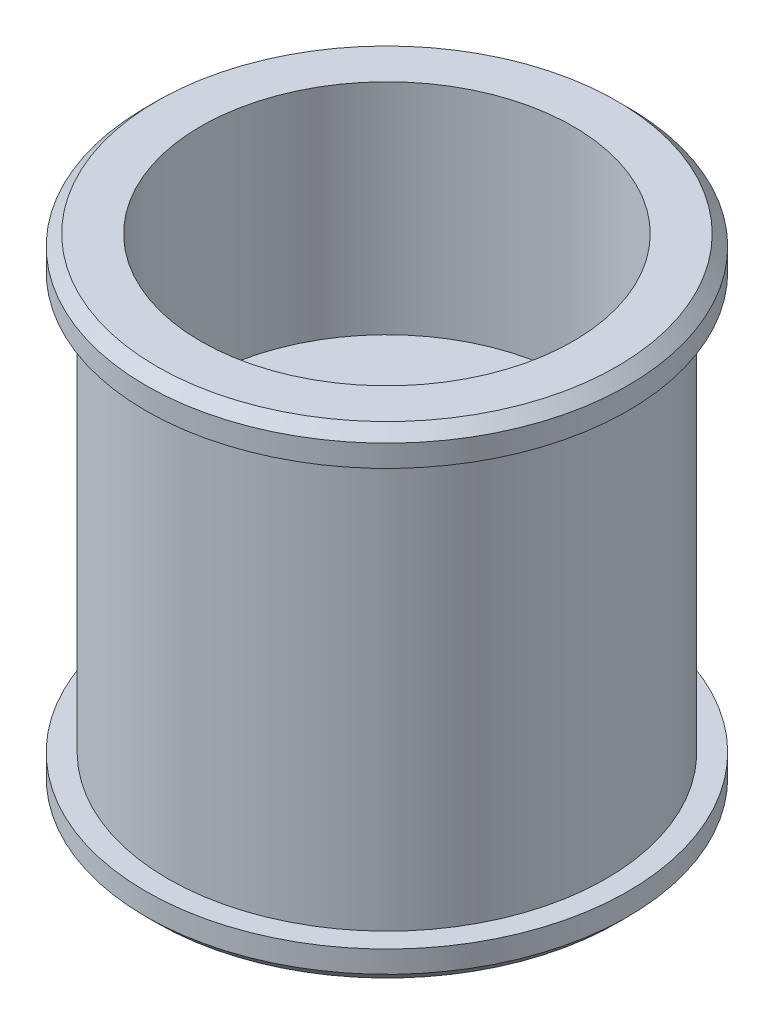
ISO-10303-21;
HEADER;
FILE_DESCRIPTION(('STEP AP214'),'2;1');
FILE_NAME('part.step','',(''),(''),'','','');
FILE_SCHEMA(('AUTOMOTIVE_DESIGN { 1 0 10303 214 1 1 1 1 }'));
ENDSEC;
DATA;
#1=APPLICATION_CONTEXT('core data for automotive mechanical design processes');
#2=APPLICATION_PROTOCOL_DEFINITION('international standard','automotive_design',2000,#1);
#3=PRODUCT_CONTEXT('',#1,'mechanical');
#4=PRODUCT('Part','Part','',(#3));
#5=PRODUCT_RELATED_PRODUCT_CATEGORY('part','',(#4));
#6=PRODUCT_DEFINITION_FORMATION('','',#4);
#7=PRODUCT_DEFINITION_CONTEXT('part definition',#1,'design');
#8=PRODUCT_DEFINITION('design','',#6,#7);
#9=PRODUCT_DEFINITION_SHAPE('','',#8);
#10=(LENGTH_UNIT() NAMED_UNIT(*) SI_UNIT(.MILLI.,.METRE.));
#11=(NAMED_UNIT(*) PLANE_ANGLE_UNIT() SI_UNIT($,.RADIAN.));
#12=(NAMED_UNIT(*) SI_UNIT($,.STERADIAN.) SOLID_ANGLE_UNIT());
#13=UNCERTAINTY_MEASURE_WITH_UNIT(LENGTH_MEASURE(1.E-05),#10,'distance_accuracy_value','');
#14=(GEOMETRIC_REPRESENTATION_CONTEXT(3) GLOBAL_UNCERTAINTY_ASSIGNED_CONTEXT((#13)) GLOBAL_UNIT_ASSIGNED_CONTEXT((#10,
#11,#12)) REPRESENTATION_CONTEXT('',''));
#15=CARTESIAN_POINT('',(0.,0.,0.));
#16=DIRECTION('',(0.,0.,1.));
#17=DIRECTION('',(1.,0.,0.));
#18=AXIS2_PLACEMENT_3D('',#15,#16,#17);
#19=CARTESIAN_POINT('',(0.,22.,0.));
#20=DIRECTION('',(0.,-1.,0.));
#21=DIRECTION('',(0.,0.,-1.));
#22=AXIS2_PLACEMENT_3D('',#19,#20,#21);
#23=CYLINDRICAL_SURFACE('',#22,1.5);
#24=CARTESIAN_POINT('',(0.,0.,0.));
#25=DIRECTION('',(0.,1.,0.));
#26=DIRECTION('',(0.,0.,1.));
#27=AXIS2_PLACEMENT_3D('',#24,#25,#26);
#28=CIRCLE('',#27,1.5);
#29=CARTESIAN_POINT('',(0.,0.,1.5));
#30=VERTEX_POINT('',#29);
#31=EDGE_CURVE('E56',#30,#30,#28,.T.);
#32=ORIENTED_EDGE('',*,*,#31,.F.);
#33=EDGE_LOOP('',(#32));
#34=FACE_BOUND('',#33,.T.);
#35=CARTESIAN_POINT('',(-1.1180339887499,4.52987032528327,-1.));
#36=CARTESIAN_POINT('',(-1.11803876731408,4.57868448071758,-0.999997269988655));
#37=CARTESIAN_POINT('',(-1.12129035523721,4.62751570213767,-0.99639496251832));
#38=CARTESIAN_POINT('',(-1.13365986250808,4.72343028110868,-0.982291341588655));
#39=CARTESIAN_POINT('',(-1.14278830406355,4.77051034304805,-0.971777652939311));
#40=CARTESIAN_POINT('',(-1.16528292912785,4.86123804622211,-0.94467930838316));
#41=CARTESIAN_POINT('',(-1.17860780897301,4.9049141736521,-0.92815359007107));
#42=CARTESIAN_POINT('',(-1.20792047340913,4.9888032414566,-0.889670041967692));
#43=CARTESIAN_POINT('',(-1.22390881079415,5.02901546027151,-0.867711084060814));
#44=CARTESIAN_POINT('',(-1.25973036466013,5.11169376909173,-0.815012050038569));
#45=CARTESIAN_POINT('',(-1.27977468045182,5.15353638414187,-0.783437177258661));
#46=CARTESIAN_POINT('',(-1.31972413654041,5.23187167972041,-0.714096098703399));
#47=CARTESIAN_POINT('',(-1.33962912148992,5.26835908611254,-0.6763238658854));
#48=CARTESIAN_POINT('',(-1.38044409261874,5.3401921546741,-0.589078452471477));
#49=CARTESIAN_POINT('',(-1.40108392923461,5.37461158117111,-0.538703219829095));
#50=CARTESIAN_POINT('',(-1.43779242241382,5.43419137302831,-0.431235482106116));
#51=CARTESIAN_POINT('',(-1.45386618115518,5.45936208229887,-0.374150576160852));
#52=CARTESIAN_POINT('',(-1.47799953732363,5.496648525792,-0.261624536740002));
#53=CARTESIAN_POINT('',(-1.48675587807934,5.50991199753105,-0.206717362590709));
#54=CARTESIAN_POINT('',(-1.49804872730961,5.52696256992509,-0.0948477243649315));
#55=CARTESIAN_POINT('',(-1.5005930688118,5.53076160489599,-0.037887940642913));
#56=CARTESIAN_POINT('',(-1.49927680861477,5.52878410030875,0.0670735251161643));
#57=CARTESIAN_POINT('',(-1.49633132455064,5.52437579962474,0.115120319004376));
#58=CARTESIAN_POINT('',(-1.4860409139501,5.50882479960382,0.209619316635507));
#59=CARTESIAN_POINT('',(-1.47869566656551,5.4976816091315,0.256071403824861));
#60=CARTESIAN_POINT('',(-1.46026045851868,5.46927248288598,0.346038968835584));
#61=CARTESIAN_POINT('',(-1.44918538991339,5.45203088268399,0.38956531192298));
#62=CARTESIAN_POINT('',(-1.42410552238144,5.41209350380686,0.473104575326777));
#63=CARTESIAN_POINT('',(-1.41010018872581,5.38939672953252,0.513116852484701));
#64=CARTESIAN_POINT('',(-1.37809029225351,5.33588095655333,0.594142145981719));
#65=CARTESIAN_POINT('',(-1.35980204396013,5.30438656360688,0.634595740498538));
#66=CARTESIAN_POINT('',(-1.32200300913499,5.23592098554311,0.709994037491522));
#67=CARTESIAN_POINT('',(-1.30249036407616,5.19894135231637,0.744930067597284));
#68=CARTESIAN_POINT('',(-1.26075022472076,5.11388872017663,0.813861176630826));
#69=CARTESIAN_POINT('',(-1.23857160004468,5.06498478542603,0.846867965631776));
#70=CARTESIAN_POINT('',(-1.19737805415546,4.96111540567291,0.904174374727407));
#71=CARTESIAN_POINT('',(-1.17835785767438,4.9061603280763,0.92848859327447));
#72=CARTESIAN_POINT('',(-1.15131435153449,4.80751079424673,0.961663622838891));
#73=CARTESIAN_POINT('',(-1.1417018228885,4.76507364025488,0.972953958737704));
#74=CARTESIAN_POINT('',(-1.1270451989479,4.67835058037481,0.989897777900029));
#75=CARTESIAN_POINT('',(-1.12199318391119,4.63406801969681,0.995561034821825));
#76=CARTESIAN_POINT('',(-1.11723778493745,4.54464883206268,1.00089700074453));
#77=CARTESIAN_POINT('',(-1.11755766933454,4.49950933602379,1.00054364876605));
#78=CARTESIAN_POINT('',(-1.12354940184257,4.41002840830517,0.993808148581262));
#79=CARTESIAN_POINT('',(-1.12922558823607,4.36568765322741,0.987421113449806));
#80=CARTESIAN_POINT('',(-1.14463988751152,4.28117561651041,0.969499055937226));
#81=CARTESIAN_POINT('',(-1.15416593537715,4.24090647078949,0.958230872657146));
#82=CARTESIAN_POINT('',(-1.17614979263984,4.16280720725061,0.931115208135282));
#83=CARTESIAN_POINT('',(-1.18860858636727,4.12497791377377,0.915266188999618));
#84=CARTESIAN_POINT('',(-1.21805741810736,4.0447693233949,0.875816733031263));
#85=CARTESIAN_POINT('',(-1.23545540768822,4.00299191965232,0.851300144226031));
#86=CARTESIAN_POINT('',(-1.27131257456476,3.9236619241183,0.79676365764559));
#87=CARTESIAN_POINT('',(-1.2897730248931,3.88611456695385,0.766737059459379));
#88=CARTESIAN_POINT('',(-1.33037839141598,3.80788915149803,0.694383288512648));
#89=CARTESIAN_POINT('',(-1.35244726064259,3.76831890114542,0.650801932557862));
#90=CARTESIAN_POINT('',(-1.39387790925842,3.6969619838268,0.556549744344255));
#91=CARTESIAN_POINT('',(-1.41324207395941,3.66516843965821,0.505885238731677));
#92=CARTESIAN_POINT('',(-1.44395410620131,3.61592445582181,0.408743737408333));
#93=CARTESIAN_POINT('',(-1.45612729055242,3.59689207306237,0.363331182442473));
#94=CARTESIAN_POINT('',(-1.47639353933783,3.56556672812376,0.269378539510945));
#95=CARTESIAN_POINT('',(-1.48449004936067,3.55326807385358,0.220841131929569));
#96=CARTESIAN_POINT('',(-1.49589182013302,3.5360218433637,0.121684696151537));
#97=CARTESIAN_POINT('',(-1.49917575428247,3.53110698552988,0.0710574184621101));
#98=CARTESIAN_POINT('',(-1.50054910514547,3.52904639957477,-0.0304277732903161));
#99=CARTESIAN_POINT('',(-1.49863900469456,3.5318999493052,-0.0812856654767108));
#100=CARTESIAN_POINT('',(-1.49014777988657,3.54470006978561,-0.177878766264065));
#101=CARTESIAN_POINT('',(-1.48391638604927,3.55411581771417,-0.223717571535269));
#102=CARTESIAN_POINT('',(-1.46768053103468,3.57898932999872,-0.313009211498528));
#103=CARTESIAN_POINT('',(-1.45767548373552,3.5944480329569,-0.356461674343444));
#104=CARTESIAN_POINT('',(-1.43395882743097,3.63183967772528,-0.442573648304176));
#105=CARTESIAN_POINT('',(-1.42006624473169,3.65409547903081,-0.485041794600133));
#106=CARTESIAN_POINT('',(-1.38987704117736,3.70394564759626,-0.565776331341591));
#107=CARTESIAN_POINT('',(-1.37357898322632,3.73154320925927,-0.604040186025009));
#108=CARTESIAN_POINT('',(-1.33696465736197,3.79618477645143,-0.68164711100701));
#109=CARTESIAN_POINT('',(-1.31641956938685,3.83403183712029,-0.720213397630456));
#110=CARTESIAN_POINT('',(-1.27526678824743,3.91542709605619,-0.790800111407978));
#111=CARTESIAN_POINT('',(-1.25465905985077,3.95897951970032,-0.822815641619616));
#112=CARTESIAN_POINT('',(-1.21692106795149,4.04780412066092,-0.877566267592056));
#113=CARTESIAN_POINT('',(-1.19964543370952,4.09269123025844,-0.90082323448605));
#114=CARTESIAN_POINT('',(-1.16873750795511,4.18651254977985,-0.940579011701362));
#115=CARTESIAN_POINT('',(-1.15509815647652,4.23543867221435,-0.957090951406666));
#116=CARTESIAN_POINT('',(-1.1359552596477,4.32525605949554,-0.979681312354539));
#117=CARTESIAN_POINT('',(-1.12931847705076,4.36552444367842,-0.987261141866241));
#118=CARTESIAN_POINT('',(-1.12035759608004,4.44714852553554,-0.997419579094631));
#119=CARTESIAN_POINT('',(-1.11802993920738,4.48850329741356,-1.00000231351858));
#120=CARTESIAN_POINT('',(-1.1180339887499,4.52987032528327,-1.));
#121=B_SPLINE_CURVE_WITH_KNOTS('',3,(#35,#36,#37,#38,#39,#40,#41,#42,#43,#44,#45,#46,#47,#48,
#49,#50,#51,#52,#53,#54,#55,#56,#57,#58,#59,#60,#61,#62,#63,#64,#65,#66,#67,#68,#69,#70,#71,#72,
#73,#74,#75,#76,#77,#78,#79,#80,#81,#82,#83,#84,#85,#86,#87,#88,#89,#90,#91,#92,#93,#94,#95,#96,
#97,#98,#99,#100,#101,#102,#103,#104,#105,#106,#107,#108,#109,#110,#111,#112,#113,#114,#115,
#116,#117,#118,#119,#120),.UNSPECIFIED.,.T.,.F.,(4,2,2,2,2,2,2,2,2,2,2,2,2,2,2,2,2,2,2,2,2,2,2,
2,2,2,2,2,2,2,2,2,2,2,2,2,2,2,2,2,2,2,4),(0.,0.146253465361077,0.292769521129644,
0.437886325608136,0.583033286332745,0.750773385343188,0.918677592181378,1.11083515503145,
1.3027771469429,1.4731874103179,1.64338268344149,1.78769767477871,1.93202319141873,
2.07577915986595,2.219561384515,2.38223762973317,2.54516707398319,2.73339351752472,
2.92130234871974,3.05563045200662,3.18972483117743,3.32440018819018,3.45918471785299,
3.58738225853468,3.71562288822479,3.86949615025543,4.0235577839993,4.21127342259657,
4.39882245285466,4.55035290305024,4.70175506443411,4.85382614632258,5.00588309222248,
5.1468839112404,5.28790663945594,5.43708931492125,5.58636147964719,5.75911103141433,
5.93198925208477,6.09167062897535,6.25103968323788,6.37508308151303,6.49902399831892),.UNSPECIFIED.);
#122=CARTESIAN_POINT('',(-1.1180339887499,4.52987032528327,-1.));
#123=VERTEX_POINT('',#122);
#124=EDGE_CURVE('E65',#123,#123,#121,.T.);
#125=ORIENTED_EDGE('',*,*,#124,.F.);
#126=EDGE_LOOP('',(#125));
#127=FACE_BOUND('',#126,.T.);
#128=CARTESIAN_POINT('',(0.,12.,0.));
#129=DIRECTION('',(0.,1.,0.));
#130=DIRECTION('',(0.,0.,1.));
#131=AXIS2_PLACEMENT_3D('',#128,#129,#130);
#132=CIRCLE('',#131,1.5);
#133=CARTESIAN_POINT('',(0.,12.,1.5));
#134=VERTEX_POINT('',#133);
#135=EDGE_CURVE('E40',#134,#134,#132,.T.);
#136=ORIENTED_EDGE('',*,*,#135,.T.);
#137=EDGE_LOOP('',(#136));
#138=FACE_BOUND('',#137,.T.);
#139=ADVANCED_FACE('F35',(#34,#127,#138),#23,.F.);
#140=CARTESIAN_POINT('',(0.,22.,0.));
#141=DIRECTION('',(0.,-1.,0.));
#142=DIRECTION('',(0.,0.,-1.));
#143=AXIS2_PLACEMENT_3D('',#140,#141,#142);
#144=CYLINDRICAL_SURFACE('',#143,11.);
#145=CARTESIAN_POINT('',(0.,0.500000000000004,0.));
#146=DIRECTION('',(0.,1.,0.));
#147=DIRECTION('',(0.,0.,1.));
#148=AXIS2_PLACEMENT_3D('',#145,#146,#147);
#149=CIRCLE('',#148,11.);
#150=CARTESIAN_POINT('',(0.,0.500000000000004,11.));
#151=VERTEX_POINT('',#150);
#152=EDGE_CURVE('E53',#151,#151,#149,.T.);
#153=ORIENTED_EDGE('',*,*,#152,.T.);
#154=EDGE_LOOP('',(#153));
#155=FACE_BOUND('',#154,.T.);
#156=CARTESIAN_POINT('',(0.,1.5,0.));
#157=DIRECTION('',(0.,1.,0.));
#158=DIRECTION('',(0.,0.,1.));
#159=AXIS2_PLACEMENT_3D('',#156,#157,#158);
#160=CIRCLE('',#159,11.);
#161=CARTESIAN_POINT('',(0.,1.5,11.));
#162=VERTEX_POINT('',#161);
#163=EDGE_CURVE('E66',#162,#162,#160,.T.);
#164=ORIENTED_EDGE('',*,*,#163,.F.);
#165=EDGE_LOOP('',(#164));
#166=FACE_BOUND('',#165,.T.);
#167=ADVANCED_FACE('F97',(#155,#166),#144,.T.);
#168=CARTESIAN_POINT('',(0.,22.,0.));
#169=DIRECTION('',(0.,1.,0.));
#170=DIRECTION('',(0.,0.,1.));
#171=AXIS2_PLACEMENT_3D('',#168,#169,#170);
#172=PLANE('',#171);
#173=CARTESIAN_POINT('',(0.,22.,0.));
#174=DIRECTION('',(0.,1.,0.));
#175=DIRECTION('',(0.,0.,1.));
#176=AXIS2_PLACEMENT_3D('',#173,#174,#175);
#177=CIRCLE('',#176,8.5);
#178=CARTESIAN_POINT('',(0.,22.,8.5));
#179=VERTEX_POINT('',#178);
#180=EDGE_CURVE('E89',#179,#179,#177,.T.);
#181=ORIENTED_EDGE('',*,*,#180,.F.);
#182=EDGE_LOOP('',(#181));
#183=FACE_BOUND('',#182,.T.);
#184=CARTESIAN_POINT('',(0.,22.,0.));
#185=DIRECTION('',(0.,1.,0.));
#186=DIRECTION('',(0.,0.,1.));
#187=AXIS2_PLACEMENT_3D('',#184,#185,#186);
#188=CIRCLE('',#187,10.5);
#189=CARTESIAN_POINT('',(0.,22.,10.5));
#190=VERTEX_POINT('',#189);
#191=EDGE_CURVE('E44',#190,#190,#188,.T.);
#192=ORIENTED_EDGE('',*,*,#191,.T.);
#193=EDGE_LOOP('',(#192));
#194=FACE_BOUND('',#193,.T.);
#195=ADVANCED_FACE('F100',(#183,#194),#172,.T.);
#196=CARTESIAN_POINT('',(0.,0.,0.));
#197=DIRECTION('',(0.,1.,0.));
#198=DIRECTION('',(0.,0.,1.));
#199=AXIS2_PLACEMENT_3D('',#196,#197,#198);
#200=PLANE('',#199);
#201=CARTESIAN_POINT('',(0.,0.,0.));
#202=DIRECTION('',(0.,1.,0.));
#203=DIRECTION('',(0.,0.,1.));
#204=AXIS2_PLACEMENT_3D('',#201,#202,#203);
#205=CIRCLE('',#204,10.5);
#206=CARTESIAN_POINT('',(0.,0.,10.5));
#207=VERTEX_POINT('',#206);
#208=EDGE_CURVE('E48',#207,#207,#205,.F.);
#209=ORIENTED_EDGE('',*,*,#208,.T.);
#210=EDGE_LOOP('',(#209));
#211=FACE_BOUND('',#210,.T.);
#212=ORIENTED_EDGE('',*,*,#31,.T.);
#213=EDGE_LOOP('',(#212));
#214=FACE_BOUND('',#213,.T.);
#215=ADVANCED_FACE('F103',(#211,#214),#200,.F.);
#216=CARTESIAN_POINT('',(0.,21.5,0.));
#217=DIRECTION('',(0.,1.,0.));
#218=DIRECTION('',(0.,0.,1.));
#219=AXIS2_PLACEMENT_3D('',#216,#217,#218);
#220=CIRCLE('',#219,11.);
#221=CARTESIAN_POINT('',(0.,21.5,11.));
#222=VERTEX_POINT('',#221);
#223=EDGE_CURVE('E10',#222,#222,#220,.F.);
#224=ORIENTED_EDGE('',*,*,#223,.T.);
#225=EDGE_LOOP('',(#224));
#226=FACE_BOUND('',#225,.T.);
#227=CARTESIAN_POINT('',(0.,20.5,0.));
#228=DIRECTION('',(0.,1.,0.));
#229=DIRECTION('',(0.,0.,1.));
#230=AXIS2_PLACEMENT_3D('',#227,#228,#229);
#231=CIRCLE('',#230,11.);
#232=CARTESIAN_POINT('',(0.,20.5,11.));
#233=VERTEX_POINT('',#232);
#234=EDGE_CURVE('E129',#233,#233,#231,.T.);
#235=ORIENTED_EDGE('',*,*,#234,.T.);
#236=EDGE_LOOP('',(#235));
#237=FACE_BOUND('',#236,.T.);
#238=ADVANCED_FACE('F107',(#226,#237),#144,.T.);
#239=CARTESIAN_POINT('',(0.,1.5,0.));
#240=DIRECTION('',(0.,1.,0.));
#241=DIRECTION('',(0.,0.,1.));
#242=AXIS2_PLACEMENT_3D('',#239,#240,#241);
#243=PLANE('',#242);
#244=CARTESIAN_POINT('',(0.,1.5,0.));
#245=DIRECTION('',(0.,1.,0.));
#246=DIRECTION('',(0.,0.,1.));
#247=AXIS2_PLACEMENT_3D('',#244,#245,#246);
#248=CIRCLE('',#247,10.);
#249=CARTESIAN_POINT('',(0.,1.5,10.));
#250=VERTEX_POINT('',#249);
#251=EDGE_CURVE('E91',#250,#250,#248,.T.);
#252=ORIENTED_EDGE('',*,*,#251,.F.);
#253=EDGE_LOOP('',(#252));
#254=FACE_BOUND('',#253,.T.);
#255=ORIENTED_EDGE('',*,*,#163,.T.);
#256=EDGE_LOOP('',(#255));
#257=FACE_BOUND('',#256,.T.);
#258=ADVANCED_FACE('F110',(#254,#257),#243,.T.);
#259=CARTESIAN_POINT('',(0.,20.5,0.));
#260=DIRECTION('',(0.,1.,0.));
#261=DIRECTION('',(0.,0.,1.));
#262=AXIS2_PLACEMENT_3D('',#259,#260,#261);
#263=PLANE('',#262);
#264=CARTESIAN_POINT('',(0.,20.5,0.));
#265=DIRECTION('',(0.,1.,0.));
#266=DIRECTION('',(0.,0.,1.));
#267=AXIS2_PLACEMENT_3D('',#264,#265,#266);
#268=CIRCLE('',#267,10.);
#269=CARTESIAN_POINT('',(0.,20.5,10.));
#270=VERTEX_POINT('',#269);
#271=EDGE_CURVE('E88',#270,#270,#268,.T.);
#272=ORIENTED_EDGE('',*,*,#271,.T.);
#273=EDGE_LOOP('',(#272));
#274=FACE_BOUND('',#273,.T.);
#275=ORIENTED_EDGE('',*,*,#234,.F.);
#276=EDGE_LOOP('',(#275));
#277=FACE_BOUND('',#276,.T.);
#278=ADVANCED_FACE('F99',(#274,#277),#263,.F.);
#279=CARTESIAN_POINT('',(0.,1.5,0.));
#280=DIRECTION('',(0.,1.,0.));
#281=DIRECTION('',(0.,0.,1.));
#282=AXIS2_PLACEMENT_3D('',#279,#280,#281);
#283=CYLINDRICAL_SURFACE('',#282,10.);
#284=CARTESIAN_POINT('',(-9.9498743710662,4.52987032528327,-1.));
#285=CARTESIAN_POINT('',(-9.94987502796903,4.47385076110967,-0.999997573393512));
#286=CARTESIAN_POINT('',(-9.95035256994218,4.41779415687143,-0.995276858982475));
#287=CARTESIAN_POINT('',(-9.95221087558119,4.30723513898973,-0.976516314763561));
#288=CARTESIAN_POINT('',(-9.95359263461219,4.25273450724578,-0.962466214886435));
#289=CARTESIAN_POINT('',(-9.95710133047387,4.14690450606537,-0.925460116068926));
#290=CARTESIAN_POINT('',(-9.9592278154679,4.09557323589183,-0.902509516293899));
#291=CARTESIAN_POINT('',(-9.9639858057182,3.99750253299152,-0.848364267391101));
#292=CARTESIAN_POINT('',(-9.96661721064329,3.95076219079955,-0.817171255625926));
#293=CARTESIAN_POINT('',(-9.97209926709899,3.86301906162577,-0.747304761998705));
#294=CARTESIAN_POINT('',(-9.97495060005266,3.82203531577949,-0.70860741810826));
#295=CARTESIAN_POINT('',(-9.98054505235719,3.7471327162797,-0.624881715319565));
#296=CARTESIAN_POINT('',(-9.98328816675213,3.71321418587696,-0.579853066906569));
#297=CARTESIAN_POINT('',(-9.98836383155605,3.65333906827612,-0.484626361650988));
#298=CARTESIAN_POINT('',(-9.99069550894647,3.62739932648961,-0.434417662529569));
#299=CARTESIAN_POINT('',(-9.9946781687577,3.58432589213459,-0.330329984287511));
#300=CARTESIAN_POINT('',(-9.99632916777064,3.5671919849138,-0.276451094668219));
#301=CARTESIAN_POINT('',(-9.99875966571026,3.54227241593002,-0.16674478274295));
#302=CARTESIAN_POINT('',(-9.99954207842817,3.53445549253333,-0.110924527031582));
#303=CARTESIAN_POINT('',(-10.0001571559869,3.52829505614955,0.00124074068894251));
#304=CARTESIAN_POINT('',(-9.99998984545273,3.529951297537,0.0575857390544606));
#305=CARTESIAN_POINT('',(-9.99872671311186,3.54266479793343,0.168988844064559));
#306=CARTESIAN_POINT('',(-9.99763421151713,3.55368844084716,0.224050829934978));
#307=CARTESIAN_POINT('',(-9.9946472926493,3.58477145422989,0.331539179504532));
#308=CARTESIAN_POINT('',(-9.99275286495953,3.60483094207084,0.383965508957728));
#309=CARTESIAN_POINT('',(-9.98836937483915,3.65345308853771,0.484800314679585));
#310=CARTESIAN_POINT('',(-9.98587927365758,3.68203062281343,0.533201570981649));
#311=CARTESIAN_POINT('',(-9.98058384519407,3.74686684861964,0.624533513174193));
#312=CARTESIAN_POINT('',(-9.97777850866811,3.78312576542845,0.667464038560827));
#313=CARTESIAN_POINT('',(-9.97215293467852,3.86248455479692,0.746832771822688));
#314=CARTESIAN_POINT('',(-9.96933268573028,3.90561367002485,0.783241746190344));
#315=CARTESIAN_POINT('',(-9.96400739928222,3.99738719049405,0.848307535357917));
#316=CARTESIAN_POINT('',(-9.96150236223964,4.04603160373541,0.876964338912889));
#317=CARTESIAN_POINT('',(-9.95709089514149,4.14747735048306,0.92571218457323));
#318=CARTESIAN_POINT('',(-9.95518459132554,4.20027955770616,0.945801420572959));
#319=CARTESIAN_POINT('',(-9.95218901870938,4.30853092989796,0.976820735637589));
#320=CARTESIAN_POINT('',(-9.95109972501768,4.36398001417072,0.987751093743033));
#321=CARTESIAN_POINT('',(-9.94986580527417,4.47569450481278,1.00010477539196));
#322=CARTESIAN_POINT('',(-9.94971711547603,4.5319553455481,1.00156899664721));
#323=CARTESIAN_POINT('',(-9.95037051354771,4.64392159110613,0.995056246871362));
#324=CARTESIAN_POINT('',(-9.95117258857061,4.69962700342364,0.987079403409754));
#325=CARTESIAN_POINT('',(-9.95363344422402,4.80878190756161,0.96194517450752));
#326=CARTESIAN_POINT('',(-9.95529042001345,4.86223589637793,0.944807127188908));
#327=CARTESIAN_POINT('',(-9.95927291038795,4.96551037701358,0.901856719675939));
#328=CARTESIAN_POINT('',(-9.9615984402867,5.01533078557045,0.876044160783588));
#329=CARTESIAN_POINT('',(-9.96666584355714,5.11011029931205,0.816375001423218));
#330=CARTESIAN_POINT('',(-9.96940910814672,5.15505226724953,0.782491299840691));
#331=CARTESIAN_POINT('',(-9.97499832625186,5.23862537855734,0.707680533451174));
#332=CARTESIAN_POINT('',(-9.97784428230866,5.27725636562335,0.666753294248135));
#333=CARTESIAN_POINT('',(-9.98333047849302,5.34725195868136,0.578839804226475));
#334=CARTESIAN_POINT('',(-9.98596994055474,5.37858988486949,0.531832255969452));
#335=CARTESIAN_POINT('',(-9.99073442106631,5.43292619378968,0.433197717417132));
#336=CARTESIAN_POINT('',(-9.99285944656492,5.45592469079038,0.381570790429626));
#337=CARTESIAN_POINT('',(-9.99635210414006,5.49288409293861,0.275256126432816));
#338=CARTESIAN_POINT('',(-9.99772108605649,5.50686111260848,0.22057403764996));
#339=CARTESIAN_POINT('',(-9.99955294613649,5.52543339486312,0.10962481398368));
#340=CARTESIAN_POINT('',(-10.0000158497656,5.53002892111731,0.0533577236922186));
#341=CARTESIAN_POINT('',(-9.99998338313269,5.52970405884333,-0.0589022240757455));
#342=CARTESIAN_POINT('',(-9.99949218376669,5.52482508844661,-0.114895207224527));
#343=CARTESIAN_POINT('',(-9.99761493577591,5.5057765796263,-0.225261888356362));
#344=CARTESIAN_POINT('',(-9.99622888644873,5.4916070339103,-0.279635585068365));
#345=CARTESIAN_POINT('',(-9.99271723813962,5.45439106789034,-0.385219908767743));
#346=CARTESIAN_POINT('',(-9.99059174003249,5.43134585834911,-0.436430966077527));
#347=CARTESIAN_POINT('',(-9.98583812416296,5.37703715636629,-0.534264600154795));
#348=CARTESIAN_POINT('',(-9.98321000934154,5.34577371201215,-0.580887203768558));
#349=CARTESIAN_POINT('',(-9.97773184669055,5.27576070625952,-0.668432724426938));
#350=CARTESIAN_POINT('',(-9.97488091460699,5.23698030903847,-0.709330926219339));
#351=CARTESIAN_POINT('',(-9.96928590769659,5.15309497373782,-0.784057759393142));
#352=CARTESIAN_POINT('',(-9.96654185867777,5.1079885201142,-0.817884691847847));
#353=CARTESIAN_POINT('',(-9.96146383410601,5.01260598336336,-0.877576640424052));
#354=CARTESIAN_POINT('',(-9.95913091925306,4.96231704395922,-0.903421187994834));
#355=CARTESIAN_POINT('',(-9.95515194762462,4.85812203403704,-0.946264708098768));
#356=CARTESIAN_POINT('',(-9.95350511653359,4.80422012135756,-0.963273657889857));
#357=CARTESIAN_POINT('',(-9.95150007538145,4.71332258438416,-0.983721688333529));
#358=CARTESIAN_POINT('',(-9.95089331935694,4.67690807397684,-0.989817712398224));
#359=CARTESIAN_POINT('',(-9.95008025177663,4.60362450224072,-0.997957658605114));
#360=CARTESIAN_POINT('',(-9.94987393853984,4.56675544282068,-1.00000159775726));
#361=CARTESIAN_POINT('',(-9.9498743710662,4.52987032528327,-1.));
#362=B_SPLINE_CURVE_WITH_KNOTS('',3,(#284,#285,#286,#287,#288,#289,#290,#291,#292,#293,#294,
#295,#296,#297,#298,#299,#300,#301,#302,#303,#304,#305,#306,#307,#308,#309,#310,#311,#312,#313,
#314,#315,#316,#317,#318,#319,#320,#321,#322,#323,#324,#325,#326,#327,#328,#329,#330,#331,#332,
#333,#334,#335,#336,#337,#338,#339,#340,#341,#342,#343,#344,#345,#346,#347,#348,#349,#350,#351,
#352,#353,#354,#355,#356,#357,#358,#359,#360,#361),.UNSPECIFIED.,.T.,.F.,(4,2,2,2,2,2,2,2,2,2,2,
2,2,2,2,2,2,2,2,2,2,2,2,2,2,2,2,2,2,2,2,2,2,2,2,2,2,2,4),(0.,0.167923994436462,
0.336033151821769,0.504040490997473,0.672014480421313,0.84053161529925,1.00905645855253,
1.17793469971292,1.34680882407795,1.51511470898449,1.68341622998232,1.85111631818661,
2.01881858480974,2.18681545466413,2.35481725218529,2.52355425085001,2.69229149427563,
2.86106429117933,3.02983194595033,3.19786996307765,3.3659057096687,3.53358814704527,
3.70127442561047,3.86953189811718,4.03779353723202,4.20666136818118,4.37552688518005,
4.54408992694361,4.71264823113149,4.88047133468483,5.04829456996658,5.21609491995246,
5.38389428810799,5.55239715037988,5.72094045034525,5.88991241070476,6.05869314894001,
6.16926027606046,6.27982693903815),.UNSPECIFIED.);
#363=CARTESIAN_POINT('',(-9.9498743710662,4.52987032528327,-1.));
#364=VERTEX_POINT('',#363);
#365=EDGE_CURVE('E57',#364,#364,#362,.T.);
#366=ORIENTED_EDGE('',*,*,#365,.F.);
#367=EDGE_LOOP('',(#366));
#368=FACE_BOUND('',#367,.T.);
#369=ORIENTED_EDGE('',*,*,#251,.T.);
#370=EDGE_LOOP('',(#369));
#371=FACE_BOUND('',#370,.T.);
#372=ORIENTED_EDGE('',*,*,#271,.F.);
#373=EDGE_LOOP('',(#372));
#374=FACE_BOUND('',#373,.T.);
#375=ADVANCED_FACE('F68',(#368,#371,#374),#283,.T.);
#376=CARTESIAN_POINT('',(-18.,4.52987032528327,0.));
#377=DIRECTION('',(1.,0.,0.));
#378=DIRECTION('',(0.,0.,-1.));
#379=AXIS2_PLACEMENT_3D('',#376,#377,#378);
#380=CYLINDRICAL_SURFACE('',#379,1.);
#381=ORIENTED_EDGE('',*,*,#124,.T.);
#382=EDGE_LOOP('',(#381));
#383=FACE_BOUND('',#382,.T.);
#384=ORIENTED_EDGE('',*,*,#365,.T.);
#385=EDGE_LOOP('',(#384));
#386=FACE_BOUND('',#385,.T.);
#387=ADVANCED_FACE('F71',(#383,#386),#380,.F.);
#388=CARTESIAN_POINT('',(0.,0.500000000000004,0.));
#389=DIRECTION('',(0.,1.,0.));
#390=DIRECTION('',(0.,0.,1.));
#391=AXIS2_PLACEMENT_3D('',#388,#389,#390);
#392=CONICAL_SURFACE('',#391,11.,0.785398163397452);
#393=ORIENTED_EDGE('',*,*,#208,.F.);
#394=EDGE_LOOP('',(#393));
#395=FACE_BOUND('',#394,.T.);
#396=ORIENTED_EDGE('',*,*,#152,.F.);
#397=EDGE_LOOP('',(#396));
#398=FACE_BOUND('',#397,.T.);
#399=ADVANCED_FACE('F75',(#395,#398),#392,.T.);
#400=CARTESIAN_POINT('',(0.,22.,0.));
#401=DIRECTION('',(0.,-1.,0.));
#402=DIRECTION('',(0.,0.,-1.));
#403=AXIS2_PLACEMENT_3D('',#400,#401,#402);
#404=CONICAL_SURFACE('',#403,10.5,0.785398163397448);
#405=ORIENTED_EDGE('',*,*,#223,.F.);
#406=EDGE_LOOP('',(#405));
#407=FACE_BOUND('',#406,.T.);
#408=ORIENTED_EDGE('',*,*,#191,.F.);
#409=EDGE_LOOP('',(#408));
#410=FACE_BOUND('',#409,.T.);
#411=ADVANCED_FACE('F38',(#407,#410),#404,.T.);
#412=CARTESIAN_POINT('',(0.,12.,0.));
#413=DIRECTION('',(0.,1.,0.));
#414=DIRECTION('',(0.,0.,1.));
#415=AXIS2_PLACEMENT_3D('',#412,#413,#414);
#416=CYLINDRICAL_SURFACE('',#415,8.5);
#417=CARTESIAN_POINT('',(0.,12.,0.));
#418=DIRECTION('',(0.,1.,0.));
#419=DIRECTION('',(0.,0.,1.));
#420=AXIS2_PLACEMENT_3D('',#417,#418,#419);
#421=CIRCLE('',#420,8.5);
#422=CARTESIAN_POINT('',(0.,12.,8.5));
#423=VERTEX_POINT('',#422);
#424=EDGE_CURVE('E233',#423,#423,#421,.T.);
#425=ORIENTED_EDGE('',*,*,#424,.F.);
#426=EDGE_LOOP('',(#425));
#427=FACE_BOUND('',#426,.T.);
#428=ORIENTED_EDGE('',*,*,#180,.T.);
#429=EDGE_LOOP('',(#428));
#430=FACE_BOUND('',#429,.T.);
#431=ADVANCED_FACE('F77',(#427,#430),#416,.F.);
#432=CARTESIAN_POINT('',(0.,12.,0.));
#433=DIRECTION('',(0.,1.,0.));
#434=DIRECTION('',(0.,0.,1.));
#435=AXIS2_PLACEMENT_3D('',#432,#433,#434);
#436=PLANE('',#435);
#437=ORIENTED_EDGE('',*,*,#135,.F.);
#438=EDGE_LOOP('',(#437));
#439=FACE_BOUND('',#438,.T.);
#440=ORIENTED_EDGE('',*,*,#424,.T.);
#441=EDGE_LOOP('',(#440));
#442=FACE_BOUND('',#441,.T.);
#443=ADVANCED_FACE('F216',(#439,#442),#436,.T.);
#444=CLOSED_SHELL('',(#139,#167,#195,#215,#238,#258,#278,#375,#387,#399,#411,#431,#443));
#445=MANIFOLD_SOLID_BREP('B2',#444);
#446=ADVANCED_BREP_SHAPE_REPRESENTATION('',(#18,#445),#14);
#447=SHAPE_DEFINITION_REPRESENTATION(#9,#446);
ENDSEC;
END-ISO-10303-21;
